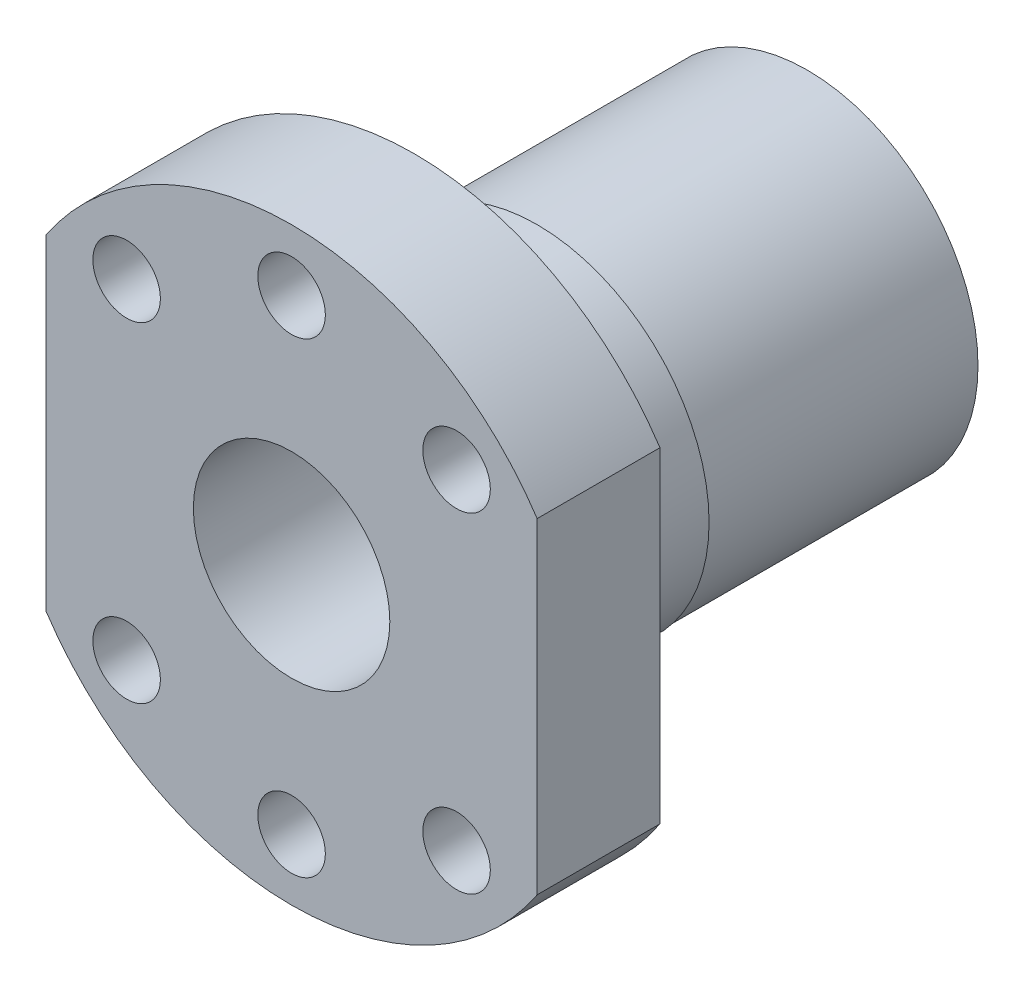
ISO-10303-21;
HEADER;
FILE_DESCRIPTION(('STEP AP214'),'2;1');
FILE_NAME('part.step','',(''),(''),'','','');
FILE_SCHEMA(('AUTOMOTIVE_DESIGN { 1 0 10303 214 1 1 1 1 }'));
ENDSEC;
DATA;
#1=APPLICATION_CONTEXT('core data for automotive mechanical design processes');
#2=APPLICATION_PROTOCOL_DEFINITION('international standard','automotive_design',2000,#1);
#3=PRODUCT_CONTEXT('',#1,'mechanical');
#4=PRODUCT('Part','Part','',(#3));
#5=PRODUCT_RELATED_PRODUCT_CATEGORY('part','',(#4));
#6=PRODUCT_DEFINITION_FORMATION('','',#4);
#7=PRODUCT_DEFINITION_CONTEXT('part definition',#1,'design');
#8=PRODUCT_DEFINITION('design','',#6,#7);
#9=PRODUCT_DEFINITION_SHAPE('','',#8);
#10=(LENGTH_UNIT() NAMED_UNIT(*) SI_UNIT(.MILLI.,.METRE.));
#11=(NAMED_UNIT(*) PLANE_ANGLE_UNIT() SI_UNIT($,.RADIAN.));
#12=(NAMED_UNIT(*) SI_UNIT($,.STERADIAN.) SOLID_ANGLE_UNIT());
#13=UNCERTAINTY_MEASURE_WITH_UNIT(LENGTH_MEASURE(1.E-05),#10,'distance_accuracy_value','');
#14=(GEOMETRIC_REPRESENTATION_CONTEXT(3) GLOBAL_UNCERTAINTY_ASSIGNED_CONTEXT((#13)) GLOBAL_UNIT_ASSIGNED_CONTEXT((#10,
#11,#12)) REPRESENTATION_CONTEXT('',''));
#15=CARTESIAN_POINT('',(0.,0.,0.));
#16=DIRECTION('',(0.,0.,1.));
#17=DIRECTION('',(1.,0.,0.));
#18=AXIS2_PLACEMENT_3D('',#15,#16,#17);
#19=CARTESIAN_POINT('',(0.,0.,10.));
#20=DIRECTION('',(0.,0.,1.));
#21=DIRECTION('',(1.,0.,0.));
#22=AXIS2_PLACEMENT_3D('',#19,#20,#21);
#23=PLANE('',#22);
#24=CARTESIAN_POINT('',(0.,0.,10.));
#25=DIRECTION('',(0.,0.,1.));
#26=DIRECTION('',(1.,0.,0.));
#27=AXIS2_PLACEMENT_3D('',#24,#25,#26);
#28=CIRCLE('',#27,8.);
#29=CARTESIAN_POINT('',(8.,0.,10.));
#30=VERTEX_POINT('',#29);
#31=EDGE_CURVE('E412',#30,#30,#28,.T.);
#32=ORIENTED_EDGE('',*,*,#31,.F.);
#33=EDGE_LOOP('',(#32));
#34=FACE_BOUND('',#33,.T.);
#35=CARTESIAN_POINT('',(13.4350288425444,-13.4350288425444,10.));
#36=DIRECTION('',(0.,0.,1.));
#37=DIRECTION('',(1.,0.,0.));
#38=AXIS2_PLACEMENT_3D('',#35,#36,#37);
#39=CIRCLE('',#38,2.75);
#40=CARTESIAN_POINT('',(16.1850288425444,-13.4350288425444,10.));
#41=VERTEX_POINT('',#40);
#42=EDGE_CURVE('E392',#41,#41,#39,.F.);
#43=ORIENTED_EDGE('',*,*,#42,.T.);
#44=EDGE_LOOP('',(#43));
#45=FACE_BOUND('',#44,.T.);
#46=CARTESIAN_POINT('',(0.,-19.,10.));
#47=DIRECTION('',(0.,0.,1.));
#48=DIRECTION('',(1.,0.,0.));
#49=AXIS2_PLACEMENT_3D('',#46,#47,#48);
#50=CIRCLE('',#49,2.75);
#51=CARTESIAN_POINT('',(2.75,-19.,10.));
#52=VERTEX_POINT('',#51);
#53=EDGE_CURVE('E388',#52,#52,#50,.F.);
#54=ORIENTED_EDGE('',*,*,#53,.T.);
#55=EDGE_LOOP('',(#54));
#56=FACE_BOUND('',#55,.T.);
#57=CARTESIAN_POINT('',(-13.4350288425443,-13.4350288425445,10.));
#58=DIRECTION('',(0.,0.,1.));
#59=DIRECTION('',(1.,0.,0.));
#60=AXIS2_PLACEMENT_3D('',#57,#58,#59);
#61=CIRCLE('',#60,2.75);
#62=CARTESIAN_POINT('',(-10.6850288425443,-13.4350288425445,10.));
#63=VERTEX_POINT('',#62);
#64=EDGE_CURVE('E126',#63,#63,#61,.F.);
#65=ORIENTED_EDGE('',*,*,#64,.T.);
#66=EDGE_LOOP('',(#65));
#67=FACE_BOUND('',#66,.T.);
#68=DIRECTION('',(0.,-1.,0.));
#69=VECTOR('',#68,1.);
#70=CARTESIAN_POINT('',(20.,0.,10.));
#71=LINE('',#70,#69);
#72=CARTESIAN_POINT('',(20.,13.2664991614216,10.));
#73=VERTEX_POINT('',#72);
#74=CARTESIAN_POINT('',(20.,-13.2664991614216,10.));
#75=VERTEX_POINT('',#74);
#76=EDGE_CURVE('E87',#73,#75,#71,.T.);
#77=ORIENTED_EDGE('',*,*,#76,.F.);
#78=CARTESIAN_POINT('',(0.,0.,10.));
#79=DIRECTION('',(0.,0.,1.));
#80=DIRECTION('',(1.,0.,0.));
#81=AXIS2_PLACEMENT_3D('',#78,#79,#80);
#82=CIRCLE('',#81,24.);
#83=CARTESIAN_POINT('',(-20.,13.2664991614216,10.));
#84=VERTEX_POINT('',#83);
#85=EDGE_CURVE('E99',#73,#84,#82,.T.);
#86=ORIENTED_EDGE('',*,*,#85,.T.);
#87=DIRECTION('',(0.,-1.,0.));
#88=VECTOR('',#87,1.);
#89=CARTESIAN_POINT('',(-20.,0.,10.));
#90=LINE('',#89,#88);
#91=CARTESIAN_POINT('',(-20.,-13.2664991614216,10.));
#92=VERTEX_POINT('',#91);
#93=EDGE_CURVE('E144',#84,#92,#90,.T.);
#94=ORIENTED_EDGE('',*,*,#93,.T.);
#95=EDGE_CURVE('E101',#92,#75,#82,.T.);
#96=ORIENTED_EDGE('',*,*,#95,.T.);
#97=EDGE_LOOP('',(#77,#86,#94,#96));
#98=FACE_BOUND('',#97,.T.);
#99=CARTESIAN_POINT('',(13.4350288425444,13.4350288425444,10.));
#100=DIRECTION('',(0.,0.,1.));
#101=DIRECTION('',(1.,0.,0.));
#102=AXIS2_PLACEMENT_3D('',#99,#100,#101);
#103=CIRCLE('',#102,2.75);
#104=CARTESIAN_POINT('',(16.1850288425444,13.4350288425444,10.));
#105=VERTEX_POINT('',#104);
#106=EDGE_CURVE('E405',#105,#105,#103,.T.);
#107=ORIENTED_EDGE('',*,*,#106,.F.);
#108=EDGE_LOOP('',(#107));
#109=FACE_BOUND('',#108,.T.);
#110=CARTESIAN_POINT('',(0.,19.,10.));
#111=DIRECTION('',(0.,0.,1.));
#112=DIRECTION('',(1.,0.,0.));
#113=AXIS2_PLACEMENT_3D('',#110,#111,#112);
#114=CIRCLE('',#113,2.75);
#115=CARTESIAN_POINT('',(2.75,19.,10.));
#116=VERTEX_POINT('',#115);
#117=EDGE_CURVE('E400',#116,#116,#114,.T.);
#118=ORIENTED_EDGE('',*,*,#117,.F.);
#119=EDGE_LOOP('',(#118));
#120=FACE_BOUND('',#119,.T.);
#121=CARTESIAN_POINT('',(-13.4350288425443,13.4350288425445,10.));
#122=DIRECTION('',(0.,0.,1.));
#123=DIRECTION('',(1.,0.,0.));
#124=AXIS2_PLACEMENT_3D('',#121,#122,#123);
#125=CIRCLE('',#124,2.75);
#126=CARTESIAN_POINT('',(-10.6850288425443,13.4350288425445,10.));
#127=VERTEX_POINT('',#126);
#128=EDGE_CURVE('E395',#127,#127,#125,.T.);
#129=ORIENTED_EDGE('',*,*,#128,.F.);
#130=EDGE_LOOP('',(#129));
#131=FACE_BOUND('',#130,.T.);
#132=ADVANCED_FACE('F43',(#34,#45,#56,#67,#98,#109,#120,#131),#23,.T.);
#133=CARTESIAN_POINT('',(0.,0.,0.));
#134=DIRECTION('',(0.,0.,1.));
#135=DIRECTION('',(1.,0.,0.));
#136=AXIS2_PLACEMENT_3D('',#133,#134,#135);
#137=PLANE('',#136);
#138=CARTESIAN_POINT('',(0.,19.,0.));
#139=DIRECTION('',(0.,0.,1.));
#140=DIRECTION('',(1.,0.,0.));
#141=AXIS2_PLACEMENT_3D('',#138,#139,#140);
#142=CIRCLE('',#141,2.75);
#143=CARTESIAN_POINT('',(2.75,19.,0.));
#144=VERTEX_POINT('',#143);
#145=EDGE_CURVE('E137',#144,#144,#142,.T.);
#146=ORIENTED_EDGE('',*,*,#145,.T.);
#147=EDGE_LOOP('',(#146));
#148=FACE_BOUND('',#147,.T.);
#149=CARTESIAN_POINT('',(0.,0.,0.));
#150=DIRECTION('',(0.,0.,1.));
#151=DIRECTION('',(1.,0.,0.));
#152=AXIS2_PLACEMENT_3D('',#149,#150,#151);
#153=CIRCLE('',#152,24.);
#154=CARTESIAN_POINT('',(20.,13.2664991614216,0.));
#155=VERTEX_POINT('',#154);
#156=CARTESIAN_POINT('',(-20.,13.2664991614216,0.));
#157=VERTEX_POINT('',#156);
#158=EDGE_CURVE('E113',#155,#157,#153,.T.);
#159=ORIENTED_EDGE('',*,*,#158,.F.);
#160=DIRECTION('',(0.,-1.,0.));
#161=VECTOR('',#160,1.);
#162=CARTESIAN_POINT('',(20.,0.,0.));
#163=LINE('',#162,#161);
#164=CARTESIAN_POINT('',(20.,-13.2664991614216,0.));
#165=VERTEX_POINT('',#164);
#166=EDGE_CURVE('E11',#155,#165,#163,.T.);
#167=ORIENTED_EDGE('',*,*,#166,.T.);
#168=CARTESIAN_POINT('',(-20.,-13.2664991614216,0.));
#169=VERTEX_POINT('',#168);
#170=EDGE_CURVE('E118',#169,#165,#153,.T.);
#171=ORIENTED_EDGE('',*,*,#170,.F.);
#172=DIRECTION('',(0.,-1.,0.));
#173=VECTOR('',#172,1.);
#174=CARTESIAN_POINT('',(-20.,0.,0.));
#175=LINE('',#174,#173);
#176=EDGE_CURVE('E53',#157,#169,#175,.T.);
#177=ORIENTED_EDGE('',*,*,#176,.F.);
#178=EDGE_LOOP('',(#159,#167,#171,#177));
#179=FACE_BOUND('',#178,.T.);
#180=CARTESIAN_POINT('',(0.,0.,0.));
#181=DIRECTION('',(0.,0.,-1.));
#182=DIRECTION('',(-1.,0.,0.));
#183=AXIS2_PLACEMENT_3D('',#180,#181,#182);
#184=CIRCLE('',#183,14.);
#185=CARTESIAN_POINT('',(-14.,0.,0.));
#186=VERTEX_POINT('',#185);
#187=EDGE_CURVE('E106',#186,#186,#184,.T.);
#188=ORIENTED_EDGE('',*,*,#187,.F.);
#189=EDGE_LOOP('',(#188));
#190=FACE_BOUND('',#189,.T.);
#191=CARTESIAN_POINT('',(-13.4350288425443,-13.4350288425445,0.));
#192=DIRECTION('',(0.,0.,1.));
#193=DIRECTION('',(1.,0.,0.));
#194=AXIS2_PLACEMENT_3D('',#191,#192,#193);
#195=CIRCLE('',#194,2.75);
#196=CARTESIAN_POINT('',(-10.6850288425443,-13.4350288425445,0.));
#197=VERTEX_POINT('',#196);
#198=EDGE_CURVE('E121',#197,#197,#195,.F.);
#199=ORIENTED_EDGE('',*,*,#198,.F.);
#200=EDGE_LOOP('',(#199));
#201=FACE_BOUND('',#200,.T.);
#202=CARTESIAN_POINT('',(0.,-19.,0.));
#203=DIRECTION('',(0.,0.,1.));
#204=DIRECTION('',(1.,0.,0.));
#205=AXIS2_PLACEMENT_3D('',#202,#203,#204);
#206=CIRCLE('',#205,2.75);
#207=CARTESIAN_POINT('',(2.75,-19.,0.));
#208=VERTEX_POINT('',#207);
#209=EDGE_CURVE('E125',#208,#208,#206,.F.);
#210=ORIENTED_EDGE('',*,*,#209,.F.);
#211=EDGE_LOOP('',(#210));
#212=FACE_BOUND('',#211,.T.);
#213=CARTESIAN_POINT('',(13.4350288425444,-13.4350288425444,0.));
#214=DIRECTION('',(0.,0.,1.));
#215=DIRECTION('',(1.,0.,0.));
#216=AXIS2_PLACEMENT_3D('',#213,#214,#215);
#217=CIRCLE('',#216,2.75);
#218=CARTESIAN_POINT('',(16.1850288425444,-13.4350288425444,0.));
#219=VERTEX_POINT('',#218);
#220=EDGE_CURVE('E130',#219,#219,#217,.F.);
#221=ORIENTED_EDGE('',*,*,#220,.F.);
#222=EDGE_LOOP('',(#221));
#223=FACE_BOUND('',#222,.T.);
#224=CARTESIAN_POINT('',(13.4350288425444,13.4350288425444,0.));
#225=DIRECTION('',(0.,0.,1.));
#226=DIRECTION('',(1.,0.,0.));
#227=AXIS2_PLACEMENT_3D('',#224,#225,#226);
#228=CIRCLE('',#227,2.75);
#229=CARTESIAN_POINT('',(16.1850288425444,13.4350288425444,0.));
#230=VERTEX_POINT('',#229);
#231=EDGE_CURVE('E134',#230,#230,#228,.T.);
#232=ORIENTED_EDGE('',*,*,#231,.T.);
#233=EDGE_LOOP('',(#232));
#234=FACE_BOUND('',#233,.T.);
#235=CARTESIAN_POINT('',(-13.4350288425443,13.4350288425445,0.));
#236=DIRECTION('',(0.,0.,1.));
#237=DIRECTION('',(1.,0.,0.));
#238=AXIS2_PLACEMENT_3D('',#235,#236,#237);
#239=CIRCLE('',#238,2.75);
#240=CARTESIAN_POINT('',(-10.6850288425443,13.4350288425445,0.));
#241=VERTEX_POINT('',#240);
#242=EDGE_CURVE('E47',#241,#241,#239,.T.);
#243=ORIENTED_EDGE('',*,*,#242,.T.);
#244=EDGE_LOOP('',(#243));
#245=FACE_BOUND('',#244,.T.);
#246=ADVANCED_FACE('F173',(#148,#179,#190,#201,#212,#223,#234,#245),#137,.F.);
#247=CARTESIAN_POINT('',(0.,0.,10.));
#248=DIRECTION('',(0.,0.,-1.));
#249=DIRECTION('',(-1.,0.,0.));
#250=AXIS2_PLACEMENT_3D('',#247,#248,#249);
#251=CYLINDRICAL_SURFACE('',#250,24.);
#252=ORIENTED_EDGE('',*,*,#85,.F.);
#253=DIRECTION('',(0.,0.,1.));
#254=VECTOR('',#253,1.);
#255=CARTESIAN_POINT('',(20.,13.2664991614216,-12.));
#256=LINE('',#255,#254);
#257=EDGE_CURVE('E84',#155,#73,#256,.T.);
#258=ORIENTED_EDGE('',*,*,#257,.F.);
#259=ORIENTED_EDGE('',*,*,#158,.T.);
#260=DIRECTION('',(0.,0.,1.));
#261=VECTOR('',#260,1.);
#262=CARTESIAN_POINT('',(-20.,13.2664991614216,-12.));
#263=LINE('',#262,#261);
#264=EDGE_CURVE('E68',#157,#84,#263,.T.);
#265=ORIENTED_EDGE('',*,*,#264,.T.);
#266=EDGE_LOOP('',(#252,#258,#259,#265));
#267=FACE_BOUND('',#266,.T.);
#268=ADVANCED_FACE('F45',(#267),#251,.T.);
#269=ORIENTED_EDGE('',*,*,#170,.T.);
#270=DIRECTION('',(0.,0.,1.));
#271=VECTOR('',#270,1.);
#272=CARTESIAN_POINT('',(20.,-13.2664991614216,-12.));
#273=LINE('',#272,#271);
#274=EDGE_CURVE('E61',#165,#75,#273,.T.);
#275=ORIENTED_EDGE('',*,*,#274,.T.);
#276=ORIENTED_EDGE('',*,*,#95,.F.);
#277=DIRECTION('',(0.,0.,1.));
#278=VECTOR('',#277,1.);
#279=CARTESIAN_POINT('',(-20.,-13.2664991614216,-12.));
#280=LINE('',#279,#278);
#281=EDGE_CURVE('E103',#169,#92,#280,.T.);
#282=ORIENTED_EDGE('',*,*,#281,.F.);
#283=EDGE_LOOP('',(#269,#275,#276,#282));
#284=FACE_BOUND('',#283,.T.);
#285=ADVANCED_FACE('F171',(#284),#251,.T.);
#286=CARTESIAN_POINT('',(0.,0.,-10.));
#287=DIRECTION('',(0.,0.,1.));
#288=DIRECTION('',(1.,0.,0.));
#289=AXIS2_PLACEMENT_3D('',#286,#287,#288);
#290=CYLINDRICAL_SURFACE('',#289,14.);
#291=CARTESIAN_POINT('',(0.,0.,-10.));
#292=DIRECTION('',(0.,0.,-1.));
#293=DIRECTION('',(-1.,0.,0.));
#294=AXIS2_PLACEMENT_3D('',#291,#292,#293);
#295=CIRCLE('',#294,14.);
#296=CARTESIAN_POINT('',(-14.,0.,-10.));
#297=VERTEX_POINT('',#296);
#298=EDGE_CURVE('E159',#297,#297,#295,.T.);
#299=ORIENTED_EDGE('',*,*,#298,.F.);
#300=EDGE_LOOP('',(#299));
#301=FACE_BOUND('',#300,.T.);
#302=ORIENTED_EDGE('',*,*,#187,.T.);
#303=EDGE_LOOP('',(#302));
#304=FACE_BOUND('',#303,.T.);
#305=ADVANCED_FACE('F197',(#301,#304),#290,.T.);
#306=CARTESIAN_POINT('',(0.,0.,-10.));
#307=DIRECTION('',(0.,0.,-1.));
#308=DIRECTION('',(-1.,0.,0.));
#309=AXIS2_PLACEMENT_3D('',#306,#307,#308);
#310=PLANE('',#309);
#311=CARTESIAN_POINT('',(0.,0.,-10.));
#312=DIRECTION('',(0.,0.,-1.));
#313=DIRECTION('',(-1.,0.,0.));
#314=AXIS2_PLACEMENT_3D('',#311,#312,#313);
#315=CIRCLE('',#314,13.9);
#316=CARTESIAN_POINT('',(-13.9,0.,-10.));
#317=VERTEX_POINT('',#316);
#318=EDGE_CURVE('E111',#317,#317,#315,.T.);
#319=ORIENTED_EDGE('',*,*,#318,.F.);
#320=EDGE_LOOP('',(#319));
#321=FACE_BOUND('',#320,.T.);
#322=ORIENTED_EDGE('',*,*,#298,.T.);
#323=EDGE_LOOP('',(#322));
#324=FACE_BOUND('',#323,.T.);
#325=ADVANCED_FACE('F200',(#321,#324),#310,.T.);
#326=CARTESIAN_POINT('',(0.,0.,-32.));
#327=DIRECTION('',(0.,0.,1.));
#328=DIRECTION('',(1.,0.,0.));
#329=AXIS2_PLACEMENT_3D('',#326,#327,#328);
#330=CYLINDRICAL_SURFACE('',#329,13.9);
#331=CARTESIAN_POINT('',(0.,0.,-32.));
#332=DIRECTION('',(0.,0.,-1.));
#333=DIRECTION('',(-1.,0.,0.));
#334=AXIS2_PLACEMENT_3D('',#331,#332,#333);
#335=CIRCLE('',#334,13.9);
#336=CARTESIAN_POINT('',(-13.9,0.,-32.));
#337=VERTEX_POINT('',#336);
#338=EDGE_CURVE('E155',#337,#337,#335,.T.);
#339=ORIENTED_EDGE('',*,*,#338,.F.);
#340=EDGE_LOOP('',(#339));
#341=FACE_BOUND('',#340,.T.);
#342=ORIENTED_EDGE('',*,*,#318,.T.);
#343=EDGE_LOOP('',(#342));
#344=FACE_BOUND('',#343,.T.);
#345=ADVANCED_FACE('F185',(#341,#344),#330,.T.);
#346=CARTESIAN_POINT('',(0.,0.,-32.));
#347=DIRECTION('',(0.,0.,-1.));
#348=DIRECTION('',(-1.,0.,0.));
#349=AXIS2_PLACEMENT_3D('',#346,#347,#348);
#350=PLANE('',#349);
#351=CARTESIAN_POINT('',(0.,0.,-32.));
#352=DIRECTION('',(0.,0.,1.));
#353=DIRECTION('',(1.,0.,0.));
#354=AXIS2_PLACEMENT_3D('',#351,#352,#353);
#355=CIRCLE('',#354,8.);
#356=CARTESIAN_POINT('',(8.,0.,-32.));
#357=VERTEX_POINT('',#356);
#358=EDGE_CURVE('E401',#357,#357,#355,.T.);
#359=ORIENTED_EDGE('',*,*,#358,.T.);
#360=EDGE_LOOP('',(#359));
#361=FACE_BOUND('',#360,.T.);
#362=ORIENTED_EDGE('',*,*,#338,.T.);
#363=EDGE_LOOP('',(#362));
#364=FACE_BOUND('',#363,.T.);
#365=ADVANCED_FACE('F177',(#361,#364),#350,.T.);
#366=CARTESIAN_POINT('',(-20.,0.,-12.));
#367=DIRECTION('',(-1.,0.,0.));
#368=DIRECTION('',(0.,0.,1.));
#369=AXIS2_PLACEMENT_3D('',#366,#367,#368);
#370=PLANE('',#369);
#371=ORIENTED_EDGE('',*,*,#176,.T.);
#372=ORIENTED_EDGE('',*,*,#281,.T.);
#373=ORIENTED_EDGE('',*,*,#93,.F.);
#374=ORIENTED_EDGE('',*,*,#264,.F.);
#375=EDGE_LOOP('',(#371,#372,#373,#374));
#376=FACE_BOUND('',#375,.T.);
#377=ADVANCED_FACE('F175',(#376),#370,.T.);
#378=CARTESIAN_POINT('',(20.,0.,-12.));
#379=DIRECTION('',(-1.,0.,0.));
#380=DIRECTION('',(0.,0.,1.));
#381=AXIS2_PLACEMENT_3D('',#378,#379,#380);
#382=PLANE('',#381);
#383=ORIENTED_EDGE('',*,*,#257,.T.);
#384=ORIENTED_EDGE('',*,*,#76,.T.);
#385=ORIENTED_EDGE('',*,*,#274,.F.);
#386=ORIENTED_EDGE('',*,*,#166,.F.);
#387=EDGE_LOOP('',(#383,#384,#385,#386));
#388=FACE_BOUND('',#387,.T.);
#389=ADVANCED_FACE('F86',(#388),#382,.F.);
#390=CARTESIAN_POINT('',(-13.4350288425443,-13.4350288425445,-12.));
#391=DIRECTION('',(0.,0.,1.));
#392=DIRECTION('',(1.,0.,0.));
#393=AXIS2_PLACEMENT_3D('',#390,#391,#392);
#394=CYLINDRICAL_SURFACE('',#393,2.75);
#395=ORIENTED_EDGE('',*,*,#64,.F.);
#396=EDGE_LOOP('',(#395));
#397=FACE_BOUND('',#396,.T.);
#398=ORIENTED_EDGE('',*,*,#198,.T.);
#399=EDGE_LOOP('',(#398));
#400=FACE_BOUND('',#399,.T.);
#401=ADVANCED_FACE('F183',(#397,#400),#394,.F.);
#402=CARTESIAN_POINT('',(0.,-19.,-12.));
#403=DIRECTION('',(0.,0.,1.));
#404=DIRECTION('',(1.,0.,0.));
#405=AXIS2_PLACEMENT_3D('',#402,#403,#404);
#406=CYLINDRICAL_SURFACE('',#405,2.75);
#407=ORIENTED_EDGE('',*,*,#53,.F.);
#408=EDGE_LOOP('',(#407));
#409=FACE_BOUND('',#408,.T.);
#410=ORIENTED_EDGE('',*,*,#209,.T.);
#411=EDGE_LOOP('',(#410));
#412=FACE_BOUND('',#411,.T.);
#413=ADVANCED_FACE('F268',(#409,#412),#406,.F.);
#414=CARTESIAN_POINT('',(13.4350288425444,-13.4350288425444,-12.));
#415=DIRECTION('',(0.,0.,1.));
#416=DIRECTION('',(1.,0.,0.));
#417=AXIS2_PLACEMENT_3D('',#414,#415,#416);
#418=CYLINDRICAL_SURFACE('',#417,2.75);
#419=ORIENTED_EDGE('',*,*,#42,.F.);
#420=EDGE_LOOP('',(#419));
#421=FACE_BOUND('',#420,.T.);
#422=ORIENTED_EDGE('',*,*,#220,.T.);
#423=EDGE_LOOP('',(#422));
#424=FACE_BOUND('',#423,.T.);
#425=ADVANCED_FACE('F260',(#421,#424),#418,.F.);
#426=CARTESIAN_POINT('',(13.4350288425444,13.4350288425444,-12.));
#427=DIRECTION('',(0.,0.,1.));
#428=DIRECTION('',(1.,0.,0.));
#429=AXIS2_PLACEMENT_3D('',#426,#427,#428);
#430=CYLINDRICAL_SURFACE('',#429,2.75);
#431=ORIENTED_EDGE('',*,*,#106,.T.);
#432=EDGE_LOOP('',(#431));
#433=FACE_BOUND('',#432,.T.);
#434=ORIENTED_EDGE('',*,*,#231,.F.);
#435=EDGE_LOOP('',(#434));
#436=FACE_BOUND('',#435,.T.);
#437=ADVANCED_FACE('F252',(#433,#436),#430,.F.);
#438=CARTESIAN_POINT('',(0.,19.,-12.));
#439=DIRECTION('',(0.,0.,1.));
#440=DIRECTION('',(1.,0.,0.));
#441=AXIS2_PLACEMENT_3D('',#438,#439,#440);
#442=CYLINDRICAL_SURFACE('',#441,2.75);
#443=ORIENTED_EDGE('',*,*,#117,.T.);
#444=EDGE_LOOP('',(#443));
#445=FACE_BOUND('',#444,.T.);
#446=ORIENTED_EDGE('',*,*,#145,.F.);
#447=EDGE_LOOP('',(#446));
#448=FACE_BOUND('',#447,.T.);
#449=ADVANCED_FACE('F245',(#445,#448),#442,.F.);
#450=CARTESIAN_POINT('',(-13.4350288425443,13.4350288425445,-12.));
#451=DIRECTION('',(0.,0.,1.));
#452=DIRECTION('',(1.,0.,0.));
#453=AXIS2_PLACEMENT_3D('',#450,#451,#452);
#454=CYLINDRICAL_SURFACE('',#453,2.75);
#455=ORIENTED_EDGE('',*,*,#128,.T.);
#456=EDGE_LOOP('',(#455));
#457=FACE_BOUND('',#456,.T.);
#458=ORIENTED_EDGE('',*,*,#242,.F.);
#459=EDGE_LOOP('',(#458));
#460=FACE_BOUND('',#459,.T.);
#461=ADVANCED_FACE('F234',(#457,#460),#454,.F.);
#462=CARTESIAN_POINT('',(0.,0.,-32.));
#463=DIRECTION('',(0.,0.,1.));
#464=DIRECTION('',(1.,0.,0.));
#465=AXIS2_PLACEMENT_3D('',#462,#463,#464);
#466=CYLINDRICAL_SURFACE('',#465,8.);
#467=CARTESIAN_POINT('',(8.,0.,-32.));
#468=CARTESIAN_POINT('',(8.,0.,-31.5625));
#469=CARTESIAN_POINT('',(8.,0.,-31.125));
#470=CARTESIAN_POINT('',(8.,0.,-30.25));
#471=CARTESIAN_POINT('',(8.,0.,-29.8125));
#472=CARTESIAN_POINT('',(8.,0.,-28.9375));
#473=CARTESIAN_POINT('',(8.,0.,-28.5));
#474=CARTESIAN_POINT('',(8.,0.,-27.625));
#475=CARTESIAN_POINT('',(8.,0.,-27.1875));
#476=CARTESIAN_POINT('',(8.,0.,-26.3125));
#477=CARTESIAN_POINT('',(8.,0.,-25.875));
#478=CARTESIAN_POINT('',(8.,0.,-25.));
#479=CARTESIAN_POINT('',(8.,0.,-24.5625));
#480=CARTESIAN_POINT('',(8.,0.,-23.6875));
#481=CARTESIAN_POINT('',(8.,0.,-23.25));
#482=CARTESIAN_POINT('',(8.,0.,-22.375));
#483=CARTESIAN_POINT('',(8.,0.,-21.9375));
#484=CARTESIAN_POINT('',(8.,0.,-21.0625));
#485=CARTESIAN_POINT('',(8.,0.,-20.625));
#486=CARTESIAN_POINT('',(8.,0.,-19.75));
#487=CARTESIAN_POINT('',(8.,0.,-19.3125));
#488=CARTESIAN_POINT('',(8.,0.,-18.4375));
#489=CARTESIAN_POINT('',(8.,0.,-18.));
#490=CARTESIAN_POINT('',(8.,0.,-17.125));
#491=CARTESIAN_POINT('',(8.,0.,-16.6875));
#492=CARTESIAN_POINT('',(8.,0.,-15.8125));
#493=CARTESIAN_POINT('',(8.,0.,-15.375));
#494=CARTESIAN_POINT('',(8.,0.,-14.5));
#495=CARTESIAN_POINT('',(8.,0.,-14.0625));
#496=CARTESIAN_POINT('',(8.,0.,-13.1875));
#497=CARTESIAN_POINT('',(8.,0.,-12.75));
#498=CARTESIAN_POINT('',(8.,0.,-11.875));
#499=CARTESIAN_POINT('',(8.,0.,-11.4375));
#500=CARTESIAN_POINT('',(8.,0.,-10.5625));
#501=CARTESIAN_POINT('',(8.,0.,-10.125));
#502=CARTESIAN_POINT('',(8.,0.,-9.25));
#503=CARTESIAN_POINT('',(8.,0.,-8.8125));
#504=CARTESIAN_POINT('',(8.,0.,-7.9375));
#505=CARTESIAN_POINT('',(8.,0.,-7.5));
#506=CARTESIAN_POINT('',(8.,0.,-6.625));
#507=CARTESIAN_POINT('',(8.,0.,-6.1875));
#508=CARTESIAN_POINT('',(8.,0.,-5.3125));
#509=CARTESIAN_POINT('',(8.,0.,-4.875));
#510=CARTESIAN_POINT('',(8.,0.,-4.));
#511=CARTESIAN_POINT('',(8.,0.,-3.5625));
#512=CARTESIAN_POINT('',(8.,0.,-2.6875));
#513=CARTESIAN_POINT('',(8.,0.,-2.25));
#514=CARTESIAN_POINT('',(8.,0.,-1.375));
#515=CARTESIAN_POINT('',(8.,0.,-0.937500000000001));
#516=CARTESIAN_POINT('',(8.,0.,-0.0625000000000001));
#517=CARTESIAN_POINT('',(8.,0.,0.375));
#518=CARTESIAN_POINT('',(8.,0.,1.25));
#519=CARTESIAN_POINT('',(8.,0.,1.6875));
#520=CARTESIAN_POINT('',(8.,0.,2.5625));
#521=CARTESIAN_POINT('',(8.,0.,3.));
#522=CARTESIAN_POINT('',(8.,0.,3.875));
#523=CARTESIAN_POINT('',(8.,0.,4.3125));
#524=CARTESIAN_POINT('',(8.,0.,5.1875));
#525=CARTESIAN_POINT('',(8.,0.,5.625));
#526=CARTESIAN_POINT('',(8.,0.,6.5));
#527=CARTESIAN_POINT('',(8.,0.,6.9375));
#528=CARTESIAN_POINT('',(8.,0.,7.8125));
#529=CARTESIAN_POINT('',(8.,0.,8.25));
#530=CARTESIAN_POINT('',(8.,0.,9.125));
#531=CARTESIAN_POINT('',(8.,0.,9.5625));
#532=CARTESIAN_POINT('',(8.,0.,10.));
#533=B_SPLINE_CURVE_WITH_KNOTS('',3,(#467,#468,#469,#470,#471,#472,#473,#474,#475,#476,#477,
#478,#479,#480,#481,#482,#483,#484,#485,#486,#487,#488,#489,#490,#491,#492,#493,#494,#495,#496,
#497,#498,#499,#500,#501,#502,#503,#504,#505,#506,#507,#508,#509,#510,#511,#512,#513,#514,#515,
#516,#517,#518,#519,#520,#521,#522,#523,#524,#525,#526,#527,#528,#529,#530,#531,#532),
.UNSPECIFIED.,.F.,.F.,(4,2,2,2,2,2,2,2,2,2,2,2,2,2,2,2,2,2,2,2,2,2,2,2,2,2,2,2,2,2,2,2,4),(0.,
1.3125,2.625,3.9375,5.25,6.5625,7.875,9.18749999999999,10.5,11.8125,13.125,14.4375,15.75,
17.0625,18.375,19.6875,21.,22.3125,23.625,24.9375,26.25,27.5625,28.875,30.1875,31.5,32.8125,
34.125,35.4375,36.75,38.0625,39.375,40.6875,42.),.UNSPECIFIED.);
#534=EDGE_CURVE('BSEAM230',#357,#30,#533,.T.);
#535=ORIENTED_EDGE('',*,*,#358,.F.);
#536=ORIENTED_EDGE('',*,*,#31,.T.);
#537=ORIENTED_EDGE('',*,*,#534,.T.);
#538=ORIENTED_EDGE('',*,*,#534,.F.);
#539=EDGE_LOOP('',(#535,#537,#536,#538));
#540=FACE_BOUND('',#539,.T.);
#541=ADVANCED_FACE('F230',(#540),#466,.F.);
#542=CLOSED_SHELL('',(#132,#246,#268,#285,#305,#325,#345,#365,#377,#389,#401,#413,#425,#437,
#449,#461,#541));
#543=MANIFOLD_SOLID_BREP('B2',#542);
#544=ADVANCED_BREP_SHAPE_REPRESENTATION('',(#18,#543),#14);
#545=SHAPE_DEFINITION_REPRESENTATION(#9,#544);
ENDSEC;
END-ISO-10303-21;
